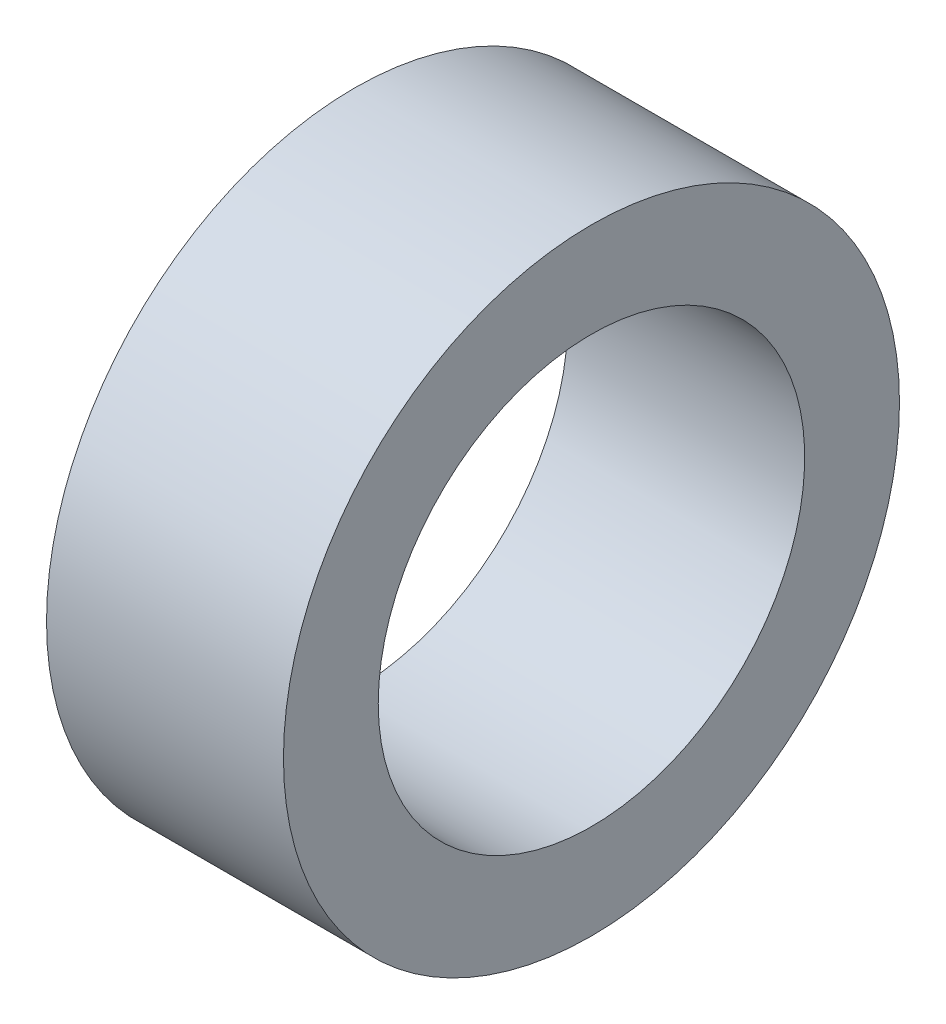
ISO-10303-21;
HEADER;
FILE_DESCRIPTION(('STEP AP214'),'2;1');
FILE_NAME('part.step','',(''),(''),'','','');
FILE_SCHEMA(('AUTOMOTIVE_DESIGN { 1 0 10303 214 1 1 1 1 }'));
ENDSEC;
DATA;
#1=APPLICATION_CONTEXT('core data for automotive mechanical design processes');
#2=APPLICATION_PROTOCOL_DEFINITION('international standard','automotive_design',2000,#1);
#3=PRODUCT_CONTEXT('',#1,'mechanical');
#4=PRODUCT('Part','Part','',(#3));
#5=PRODUCT_RELATED_PRODUCT_CATEGORY('part','',(#4));
#6=PRODUCT_DEFINITION_FORMATION('','',#4);
#7=PRODUCT_DEFINITION_CONTEXT('part definition',#1,'design');
#8=PRODUCT_DEFINITION('design','',#6,#7);
#9=PRODUCT_DEFINITION_SHAPE('','',#8);
#10=(LENGTH_UNIT() NAMED_UNIT(*) SI_UNIT(.MILLI.,.METRE.));
#11=(NAMED_UNIT(*) PLANE_ANGLE_UNIT() SI_UNIT($,.RADIAN.));
#12=(NAMED_UNIT(*) SI_UNIT($,.STERADIAN.) SOLID_ANGLE_UNIT());
#13=UNCERTAINTY_MEASURE_WITH_UNIT(LENGTH_MEASURE(1.E-05),#10,'distance_accuracy_value','');
#14=(GEOMETRIC_REPRESENTATION_CONTEXT(3) GLOBAL_UNCERTAINTY_ASSIGNED_CONTEXT((#13)) GLOBAL_UNIT_ASSIGNED_CONTEXT((#10,
#11,#12)) REPRESENTATION_CONTEXT('',''));
#15=CARTESIAN_POINT('',(0.,0.,0.));
#16=DIRECTION('',(0.,0.,1.));
#17=DIRECTION('',(1.,0.,0.));
#18=AXIS2_PLACEMENT_3D('',#15,#16,#17);
#19=CARTESIAN_POINT('',(-5.,0.,0.));
#20=DIRECTION('',(-1.,0.,0.));
#21=DIRECTION('',(0.,0.,1.));
#22=AXIS2_PLACEMENT_3D('',#19,#20,#21);
#23=CYLINDRICAL_SURFACE('',#22,9.);
#24=CARTESIAN_POINT('',(10.,0.,0.));
#25=DIRECTION('',(-1.,0.,0.));
#26=DIRECTION('',(0.,0.,1.));
#27=AXIS2_PLACEMENT_3D('',#24,#25,#26);
#28=CIRCLE('',#27,9.);
#29=CARTESIAN_POINT('',(10.,0.,9.));
#30=VERTEX_POINT('',#29);
#31=EDGE_CURVE('E51',#30,#30,#28,.T.);
#32=ORIENTED_EDGE('',*,*,#31,.F.);
#33=EDGE_LOOP('',(#32));
#34=FACE_BOUND('',#33,.T.);
#35=CARTESIAN_POINT('',(0.,0.,0.));
#36=DIRECTION('',(-1.,0.,0.));
#37=DIRECTION('',(0.,0.,1.));
#38=AXIS2_PLACEMENT_3D('',#35,#36,#37);
#39=CIRCLE('',#38,9.);
#40=CARTESIAN_POINT('',(0.,0.,9.));
#41=VERTEX_POINT('',#40);
#42=EDGE_CURVE('E10',#41,#41,#39,.T.);
#43=ORIENTED_EDGE('',*,*,#42,.T.);
#44=EDGE_LOOP('',(#43));
#45=FACE_BOUND('',#44,.T.);
#46=ADVANCED_FACE('F37',(#34,#45),#23,.F.);
#47=CARTESIAN_POINT('',(0.,9.,0.));
#48=DIRECTION('',(1.,0.,0.));
#49=DIRECTION('',(0.,0.,-1.));
#50=AXIS2_PLACEMENT_3D('',#47,#48,#49);
#51=PLANE('',#50);
#52=ORIENTED_EDGE('',*,*,#42,.F.);
#53=EDGE_LOOP('',(#52));
#54=FACE_BOUND('',#53,.T.);
#55=CARTESIAN_POINT('',(0.,0.,0.));
#56=DIRECTION('',(-1.,0.,0.));
#57=DIRECTION('',(0.,0.,1.));
#58=AXIS2_PLACEMENT_3D('',#55,#56,#57);
#59=CIRCLE('',#58,13.);
#60=CARTESIAN_POINT('',(0.,0.,13.));
#61=VERTEX_POINT('',#60);
#62=EDGE_CURVE('E43',#61,#61,#59,.T.);
#63=ORIENTED_EDGE('',*,*,#62,.T.);
#64=EDGE_LOOP('',(#63));
#65=FACE_BOUND('',#64,.T.);
#66=ADVANCED_FACE('F60',(#54,#65),#51,.F.);
#67=CARTESIAN_POINT('',(-5.,0.,0.));
#68=DIRECTION('',(-1.,0.,0.));
#69=DIRECTION('',(0.,0.,1.));
#70=AXIS2_PLACEMENT_3D('',#67,#68,#69);
#71=CYLINDRICAL_SURFACE('',#70,13.);
#72=ORIENTED_EDGE('',*,*,#62,.F.);
#73=EDGE_LOOP('',(#72));
#74=FACE_BOUND('',#73,.T.);
#75=CARTESIAN_POINT('',(10.,0.,0.));
#76=DIRECTION('',(-1.,0.,0.));
#77=DIRECTION('',(0.,0.,1.));
#78=AXIS2_PLACEMENT_3D('',#75,#76,#77);
#79=CIRCLE('',#78,13.);
#80=CARTESIAN_POINT('',(10.,0.,13.));
#81=VERTEX_POINT('',#80);
#82=EDGE_CURVE('E47',#81,#81,#79,.T.);
#83=ORIENTED_EDGE('',*,*,#82,.T.);
#84=EDGE_LOOP('',(#83));
#85=FACE_BOUND('',#84,.T.);
#86=ADVANCED_FACE('F64',(#74,#85),#71,.T.);
#87=CARTESIAN_POINT('',(10.,13.,0.));
#88=DIRECTION('',(-1.,0.,0.));
#89=DIRECTION('',(0.,0.,1.));
#90=AXIS2_PLACEMENT_3D('',#87,#88,#89);
#91=PLANE('',#90);
#92=ORIENTED_EDGE('',*,*,#82,.F.);
#93=EDGE_LOOP('',(#92));
#94=FACE_BOUND('',#93,.T.);
#95=ORIENTED_EDGE('',*,*,#31,.T.);
#96=EDGE_LOOP('',(#95));
#97=FACE_BOUND('',#96,.T.);
#98=ADVANCED_FACE('F57',(#94,#97),#91,.F.);
#99=CLOSED_SHELL('',(#46,#66,#86,#98));
#100=MANIFOLD_SOLID_BREP('B2',#99);
#101=ADVANCED_BREP_SHAPE_REPRESENTATION('',(#18,#100),#14);
#102=SHAPE_DEFINITION_REPRESENTATION(#9,#101);
ENDSEC;
END-ISO-10303-21;
